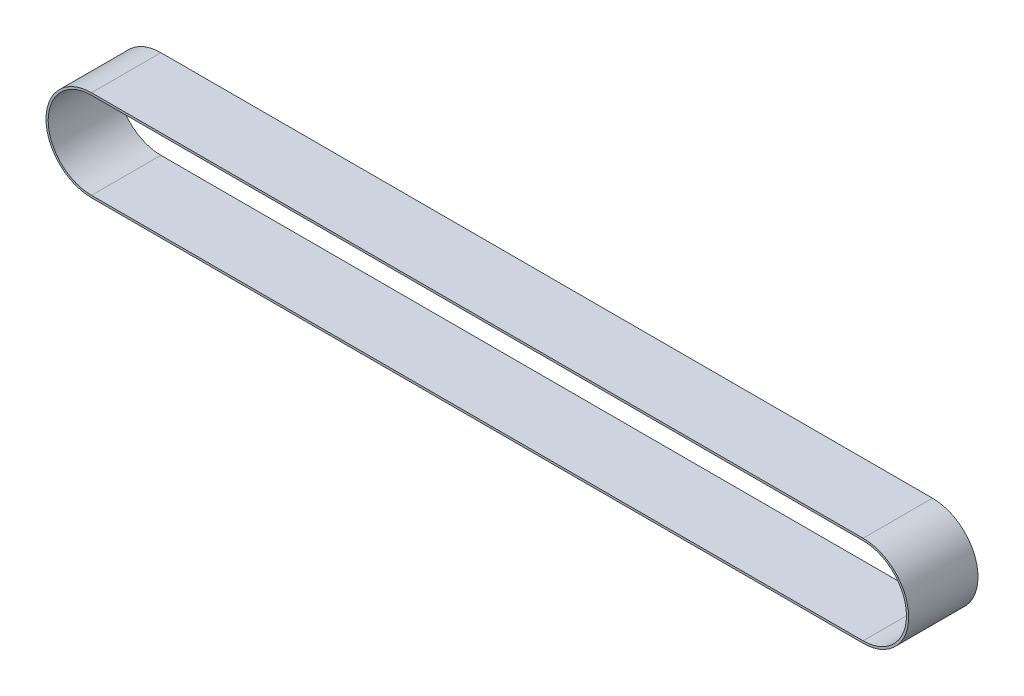
ISO-10303-21;
HEADER;
FILE_DESCRIPTION(('STEP AP214'),'2;1');
FILE_NAME('part.step','',(''),(''),'','','');
FILE_SCHEMA(('AUTOMOTIVE_DESIGN { 1 0 10303 214 1 1 1 1 }'));
ENDSEC;
DATA;
#1=APPLICATION_CONTEXT('core data for automotive mechanical design processes');
#2=APPLICATION_PROTOCOL_DEFINITION('international standard','automotive_design',2000,#1);
#3=PRODUCT_CONTEXT('',#1,'mechanical');
#4=PRODUCT('Part','Part','',(#3));
#5=PRODUCT_RELATED_PRODUCT_CATEGORY('part','',(#4));
#6=PRODUCT_DEFINITION_FORMATION('','',#4);
#7=PRODUCT_DEFINITION_CONTEXT('part definition',#1,'design');
#8=PRODUCT_DEFINITION('design','',#6,#7);
#9=PRODUCT_DEFINITION_SHAPE('','',#8);
#10=(LENGTH_UNIT() NAMED_UNIT(*) SI_UNIT(.MILLI.,.METRE.));
#11=(NAMED_UNIT(*) PLANE_ANGLE_UNIT() SI_UNIT($,.RADIAN.));
#12=(NAMED_UNIT(*) SI_UNIT($,.STERADIAN.) SOLID_ANGLE_UNIT());
#13=UNCERTAINTY_MEASURE_WITH_UNIT(LENGTH_MEASURE(1.E-05),#10,'distance_accuracy_value','');
#14=(GEOMETRIC_REPRESENTATION_CONTEXT(3) GLOBAL_UNCERTAINTY_ASSIGNED_CONTEXT((#13)) GLOBAL_UNIT_ASSIGNED_CONTEXT((#10,
#11,#12)) REPRESENTATION_CONTEXT('',''));
#15=CARTESIAN_POINT('',(0.,0.,0.));
#16=DIRECTION('',(0.,0.,1.));
#17=DIRECTION('',(1.,0.,0.));
#18=AXIS2_PLACEMENT_3D('',#15,#16,#17);
#19=CARTESIAN_POINT('',(0.,0.,50.8));
#20=DIRECTION('',(0.,0.,1.));
#21=DIRECTION('',(1.,0.,0.));
#22=AXIS2_PLACEMENT_3D('',#19,#20,#21);
#23=PLANE('',#22);
#24=CARTESIAN_POINT('',(0.,0.,50.8));
#25=DIRECTION('',(0.,0.,1.));
#26=DIRECTION('',(1.,0.,0.));
#27=AXIS2_PLACEMENT_3D('',#24,#25,#26);
#28=CIRCLE('',#27,33.3375);
#29=CARTESIAN_POINT('',(0.,33.3375,50.8));
#30=VERTEX_POINT('',#29);
#31=CARTESIAN_POINT('',(0.,-33.3375,50.8));
#32=VERTEX_POINT('',#31);
#33=EDGE_CURVE('E134',#30,#32,#28,.T.);
#34=ORIENTED_EDGE('',*,*,#33,.T.);
#35=DIRECTION('',(1.,0.,0.));
#36=VECTOR('',#35,1.);
#37=CARTESIAN_POINT('',(0.,-33.3375,50.8));
#38=LINE('',#37,#36);
#39=CARTESIAN_POINT('',(565.15,-33.3375,50.8));
#40=VERTEX_POINT('',#39);
#41=EDGE_CURVE('E137',#32,#40,#38,.T.);
#42=ORIENTED_EDGE('',*,*,#41,.T.);
#43=CARTESIAN_POINT('',(565.15,0.,50.8));
#44=DIRECTION('',(0.,0.,1.));
#45=DIRECTION('',(1.,0.,0.));
#46=AXIS2_PLACEMENT_3D('',#43,#44,#45);
#47=CIRCLE('',#46,33.3375);
#48=CARTESIAN_POINT('',(565.15,33.3375,50.8));
#49=VERTEX_POINT('',#48);
#50=EDGE_CURVE('E140',#40,#49,#47,.T.);
#51=ORIENTED_EDGE('',*,*,#50,.T.);
#52=DIRECTION('',(-1.,0.,0.));
#53=VECTOR('',#52,1.);
#54=CARTESIAN_POINT('',(0.,33.3375,50.8));
#55=LINE('',#54,#53);
#56=EDGE_CURVE('E142',#49,#30,#55,.T.);
#57=ORIENTED_EDGE('',*,*,#56,.T.);
#58=EDGE_LOOP('',(#34,#42,#51,#57));
#59=FACE_BOUND('',#58,.T.);
#60=DIRECTION('',(1.,0.,0.));
#61=VECTOR('',#60,1.);
#62=CARTESIAN_POINT('',(0.,-31.75,50.8));
#63=LINE('',#62,#61);
#64=CARTESIAN_POINT('',(0.,-31.75,50.8));
#65=VERTEX_POINT('',#64);
#66=CARTESIAN_POINT('',(565.15,-31.75,50.8));
#67=VERTEX_POINT('',#66);
#68=EDGE_CURVE('E106',#65,#67,#63,.T.);
#69=ORIENTED_EDGE('',*,*,#68,.F.);
#70=CARTESIAN_POINT('',(0.,0.,50.8));
#71=DIRECTION('',(0.,0.,1.));
#72=DIRECTION('',(1.,0.,0.));
#73=AXIS2_PLACEMENT_3D('',#70,#71,#72);
#74=CIRCLE('',#73,31.75);
#75=CARTESIAN_POINT('',(0.,31.75,50.8));
#76=VERTEX_POINT('',#75);
#77=EDGE_CURVE('E98',#76,#65,#74,.T.);
#78=ORIENTED_EDGE('',*,*,#77,.F.);
#79=DIRECTION('',(-1.,0.,0.));
#80=VECTOR('',#79,1.);
#81=CARTESIAN_POINT('',(0.,31.75,50.8));
#82=LINE('',#81,#80);
#83=CARTESIAN_POINT('',(565.15,31.75,50.8));
#84=VERTEX_POINT('',#83);
#85=EDGE_CURVE('E120',#84,#76,#82,.T.);
#86=ORIENTED_EDGE('',*,*,#85,.F.);
#87=CARTESIAN_POINT('',(565.15,0.,50.8));
#88=DIRECTION('',(0.,0.,1.));
#89=DIRECTION('',(1.,0.,0.));
#90=AXIS2_PLACEMENT_3D('',#87,#88,#89);
#91=CIRCLE('',#90,31.75);
#92=EDGE_CURVE('E118',#67,#84,#91,.T.);
#93=ORIENTED_EDGE('',*,*,#92,.F.);
#94=EDGE_LOOP('',(#69,#78,#86,#93));
#95=FACE_BOUND('',#94,.T.);
#96=ADVANCED_FACE('F33',(#59,#95),#23,.T.);
#97=CARTESIAN_POINT('',(0.,0.,0.));
#98=DIRECTION('',(0.,0.,1.));
#99=DIRECTION('',(1.,0.,0.));
#100=AXIS2_PLACEMENT_3D('',#97,#98,#99);
#101=PLANE('',#100);
#102=CARTESIAN_POINT('',(0.,0.,0.));
#103=DIRECTION('',(0.,0.,1.));
#104=DIRECTION('',(1.,0.,0.));
#105=AXIS2_PLACEMENT_3D('',#102,#103,#104);
#106=CIRCLE('',#105,33.3375);
#107=CARTESIAN_POINT('',(0.,33.3375,0.));
#108=VERTEX_POINT('',#107);
#109=CARTESIAN_POINT('',(0.,-33.3375,0.));
#110=VERTEX_POINT('',#109);
#111=EDGE_CURVE('E114',#108,#110,#106,.T.);
#112=ORIENTED_EDGE('',*,*,#111,.F.);
#113=DIRECTION('',(-1.,0.,0.));
#114=VECTOR('',#113,1.);
#115=CARTESIAN_POINT('',(0.,33.3375,0.));
#116=LINE('',#115,#114);
#117=CARTESIAN_POINT('',(565.15,33.3375,0.));
#118=VERTEX_POINT('',#117);
#119=EDGE_CURVE('E138',#118,#108,#116,.T.);
#120=ORIENTED_EDGE('',*,*,#119,.F.);
#121=CARTESIAN_POINT('',(565.15,0.,0.));
#122=DIRECTION('',(0.,0.,1.));
#123=DIRECTION('',(1.,0.,0.));
#124=AXIS2_PLACEMENT_3D('',#121,#122,#123);
#125=CIRCLE('',#124,33.3375);
#126=CARTESIAN_POINT('',(565.15,-33.3375,0.));
#127=VERTEX_POINT('',#126);
#128=EDGE_CURVE('E149',#127,#118,#125,.T.);
#129=ORIENTED_EDGE('',*,*,#128,.F.);
#130=DIRECTION('',(1.,0.,0.));
#131=VECTOR('',#130,1.);
#132=CARTESIAN_POINT('',(0.,-33.3375,0.));
#133=LINE('',#132,#131);
#134=EDGE_CURVE('E147',#110,#127,#133,.T.);
#135=ORIENTED_EDGE('',*,*,#134,.F.);
#136=EDGE_LOOP('',(#112,#120,#129,#135));
#137=FACE_BOUND('',#136,.T.);
#138=CARTESIAN_POINT('',(0.,0.,0.));
#139=DIRECTION('',(0.,0.,1.));
#140=DIRECTION('',(1.,0.,0.));
#141=AXIS2_PLACEMENT_3D('',#138,#139,#140);
#142=CIRCLE('',#141,31.75);
#143=CARTESIAN_POINT('',(0.,31.75,0.));
#144=VERTEX_POINT('',#143);
#145=CARTESIAN_POINT('',(0.,-31.75,0.));
#146=VERTEX_POINT('',#145);
#147=EDGE_CURVE('E56',#144,#146,#142,.T.);
#148=ORIENTED_EDGE('',*,*,#147,.T.);
#149=DIRECTION('',(1.,0.,0.));
#150=VECTOR('',#149,1.);
#151=CARTESIAN_POINT('',(0.,-31.75,0.));
#152=LINE('',#151,#150);
#153=CARTESIAN_POINT('',(565.15,-31.75,0.));
#154=VERTEX_POINT('',#153);
#155=EDGE_CURVE('E113',#146,#154,#152,.T.);
#156=ORIENTED_EDGE('',*,*,#155,.T.);
#157=CARTESIAN_POINT('',(565.15,0.,0.));
#158=DIRECTION('',(0.,0.,1.));
#159=DIRECTION('',(1.,0.,0.));
#160=AXIS2_PLACEMENT_3D('',#157,#158,#159);
#161=CIRCLE('',#160,31.75);
#162=CARTESIAN_POINT('',(565.15,31.75,0.));
#163=VERTEX_POINT('',#162);
#164=EDGE_CURVE('E126',#154,#163,#161,.T.);
#165=ORIENTED_EDGE('',*,*,#164,.T.);
#166=DIRECTION('',(-1.,0.,0.));
#167=VECTOR('',#166,1.);
#168=CARTESIAN_POINT('',(0.,31.75,0.));
#169=LINE('',#168,#167);
#170=EDGE_CURVE('E107',#163,#144,#169,.T.);
#171=ORIENTED_EDGE('',*,*,#170,.T.);
#172=EDGE_LOOP('',(#148,#156,#165,#171));
#173=FACE_BOUND('',#172,.T.);
#174=ADVANCED_FACE('F167',(#137,#173),#101,.F.);
#175=CARTESIAN_POINT('',(0.,0.,50.8));
#176=DIRECTION('',(0.,0.,-1.));
#177=DIRECTION('',(-1.,0.,0.));
#178=AXIS2_PLACEMENT_3D('',#175,#176,#177);
#179=CYLINDRICAL_SURFACE('',#178,33.3375);
#180=ORIENTED_EDGE('',*,*,#111,.T.);
#181=DIRECTION('',(0.,0.,-1.));
#182=VECTOR('',#181,1.);
#183=CARTESIAN_POINT('',(0.,-33.3375,50.8));
#184=LINE('',#183,#182);
#185=EDGE_CURVE('E11',#32,#110,#184,.T.);
#186=ORIENTED_EDGE('',*,*,#185,.F.);
#187=ORIENTED_EDGE('',*,*,#33,.F.);
#188=DIRECTION('',(0.,0.,-1.));
#189=VECTOR('',#188,1.);
#190=CARTESIAN_POINT('',(0.,33.3375,50.8));
#191=LINE('',#190,#189);
#192=EDGE_CURVE('E144',#30,#108,#191,.T.);
#193=ORIENTED_EDGE('',*,*,#192,.T.);
#194=EDGE_LOOP('',(#180,#186,#187,#193));
#195=FACE_BOUND('',#194,.T.);
#196=ADVANCED_FACE('F35',(#195),#179,.T.);
#197=CARTESIAN_POINT('',(0.,-33.3375,50.8));
#198=DIRECTION('',(0.,1.,0.));
#199=DIRECTION('',(0.,0.,1.));
#200=AXIS2_PLACEMENT_3D('',#197,#198,#199);
#201=PLANE('',#200);
#202=ORIENTED_EDGE('',*,*,#134,.T.);
#203=DIRECTION('',(0.,0.,-1.));
#204=VECTOR('',#203,1.);
#205=CARTESIAN_POINT('',(565.15,-33.3375,50.8));
#206=LINE('',#205,#204);
#207=EDGE_CURVE('E41',#40,#127,#206,.T.);
#208=ORIENTED_EDGE('',*,*,#207,.F.);
#209=ORIENTED_EDGE('',*,*,#41,.F.);
#210=ORIENTED_EDGE('',*,*,#185,.T.);
#211=EDGE_LOOP('',(#202,#208,#209,#210));
#212=FACE_BOUND('',#211,.T.);
#213=ADVANCED_FACE('F177',(#212),#201,.F.);
#214=CARTESIAN_POINT('',(565.15,0.,50.8));
#215=DIRECTION('',(0.,0.,-1.));
#216=DIRECTION('',(-1.,0.,0.));
#217=AXIS2_PLACEMENT_3D('',#214,#215,#216);
#218=CYLINDRICAL_SURFACE('',#217,33.3375);
#219=ORIENTED_EDGE('',*,*,#128,.T.);
#220=DIRECTION('',(0.,0.,-1.));
#221=VECTOR('',#220,1.);
#222=CARTESIAN_POINT('',(565.15,33.3375,50.8));
#223=LINE('',#222,#221);
#224=EDGE_CURVE('E154',#49,#118,#223,.T.);
#225=ORIENTED_EDGE('',*,*,#224,.F.);
#226=ORIENTED_EDGE('',*,*,#50,.F.);
#227=ORIENTED_EDGE('',*,*,#207,.T.);
#228=EDGE_LOOP('',(#219,#225,#226,#227));
#229=FACE_BOUND('',#228,.T.);
#230=ADVANCED_FACE('F161',(#229),#218,.T.);
#231=CARTESIAN_POINT('',(0.,33.3375,50.8));
#232=DIRECTION('',(0.,-1.,0.));
#233=DIRECTION('',(0.,0.,-1.));
#234=AXIS2_PLACEMENT_3D('',#231,#232,#233);
#235=PLANE('',#234);
#236=ORIENTED_EDGE('',*,*,#119,.T.);
#237=ORIENTED_EDGE('',*,*,#192,.F.);
#238=ORIENTED_EDGE('',*,*,#56,.F.);
#239=ORIENTED_EDGE('',*,*,#224,.T.);
#240=EDGE_LOOP('',(#236,#237,#238,#239));
#241=FACE_BOUND('',#240,.T.);
#242=ADVANCED_FACE('F171',(#241),#235,.F.);
#243=CARTESIAN_POINT('',(0.,0.,50.8));
#244=DIRECTION('',(0.,0.,-1.));
#245=DIRECTION('',(-1.,0.,0.));
#246=AXIS2_PLACEMENT_3D('',#243,#244,#245);
#247=CYLINDRICAL_SURFACE('',#246,31.75);
#248=ORIENTED_EDGE('',*,*,#147,.F.);
#249=DIRECTION('',(0.,0.,-1.));
#250=VECTOR('',#249,1.);
#251=CARTESIAN_POINT('',(0.,31.75,50.8));
#252=LINE('',#251,#250);
#253=EDGE_CURVE('E102',#76,#144,#252,.T.);
#254=ORIENTED_EDGE('',*,*,#253,.F.);
#255=ORIENTED_EDGE('',*,*,#77,.T.);
#256=DIRECTION('',(0.,0.,-1.));
#257=VECTOR('',#256,1.);
#258=CARTESIAN_POINT('',(0.,-31.75,50.8));
#259=LINE('',#258,#257);
#260=EDGE_CURVE('E101',#65,#146,#259,.T.);
#261=ORIENTED_EDGE('',*,*,#260,.T.);
#262=EDGE_LOOP('',(#248,#254,#255,#261));
#263=FACE_BOUND('',#262,.T.);
#264=ADVANCED_FACE('F100',(#263),#247,.F.);
#265=CARTESIAN_POINT('',(0.,-31.75,50.8));
#266=DIRECTION('',(0.,1.,0.));
#267=DIRECTION('',(0.,0.,1.));
#268=AXIS2_PLACEMENT_3D('',#265,#266,#267);
#269=PLANE('',#268);
#270=ORIENTED_EDGE('',*,*,#155,.F.);
#271=ORIENTED_EDGE('',*,*,#260,.F.);
#272=ORIENTED_EDGE('',*,*,#68,.T.);
#273=DIRECTION('',(0.,0.,-1.));
#274=VECTOR('',#273,1.);
#275=CARTESIAN_POINT('',(565.15,-31.75,50.8));
#276=LINE('',#275,#274);
#277=EDGE_CURVE('E115',#67,#154,#276,.T.);
#278=ORIENTED_EDGE('',*,*,#277,.T.);
#279=EDGE_LOOP('',(#270,#271,#272,#278));
#280=FACE_BOUND('',#279,.T.);
#281=ADVANCED_FACE('F110',(#280),#269,.T.);
#282=CARTESIAN_POINT('',(565.15,0.,50.8));
#283=DIRECTION('',(0.,0.,-1.));
#284=DIRECTION('',(-1.,0.,0.));
#285=AXIS2_PLACEMENT_3D('',#282,#283,#284);
#286=CYLINDRICAL_SURFACE('',#285,31.75);
#287=ORIENTED_EDGE('',*,*,#164,.F.);
#288=ORIENTED_EDGE('',*,*,#277,.F.);
#289=ORIENTED_EDGE('',*,*,#92,.T.);
#290=DIRECTION('',(0.,0.,-1.));
#291=VECTOR('',#290,1.);
#292=CARTESIAN_POINT('',(565.15,31.75,50.8));
#293=LINE('',#292,#291);
#294=EDGE_CURVE('E48',#84,#163,#293,.T.);
#295=ORIENTED_EDGE('',*,*,#294,.T.);
#296=EDGE_LOOP('',(#287,#288,#289,#295));
#297=FACE_BOUND('',#296,.T.);
#298=ADVANCED_FACE('F200',(#297),#286,.F.);
#299=CARTESIAN_POINT('',(0.,31.75,50.8));
#300=DIRECTION('',(0.,-1.,0.));
#301=DIRECTION('',(0.,0.,-1.));
#302=AXIS2_PLACEMENT_3D('',#299,#300,#301);
#303=PLANE('',#302);
#304=ORIENTED_EDGE('',*,*,#170,.F.);
#305=ORIENTED_EDGE('',*,*,#294,.F.);
#306=ORIENTED_EDGE('',*,*,#85,.T.);
#307=ORIENTED_EDGE('',*,*,#253,.T.);
#308=EDGE_LOOP('',(#304,#305,#306,#307));
#309=FACE_BOUND('',#308,.T.);
#310=ADVANCED_FACE('F204',(#309),#303,.T.);
#311=CLOSED_SHELL('',(#96,#174,#196,#213,#230,#242,#264,#281,#298,#310));
#312=MANIFOLD_SOLID_BREP('B2',#311);
#313=ADVANCED_BREP_SHAPE_REPRESENTATION('',(#18,#312),#14);
#314=SHAPE_DEFINITION_REPRESENTATION(#9,#313);
ENDSEC;
END-ISO-10303-21;
